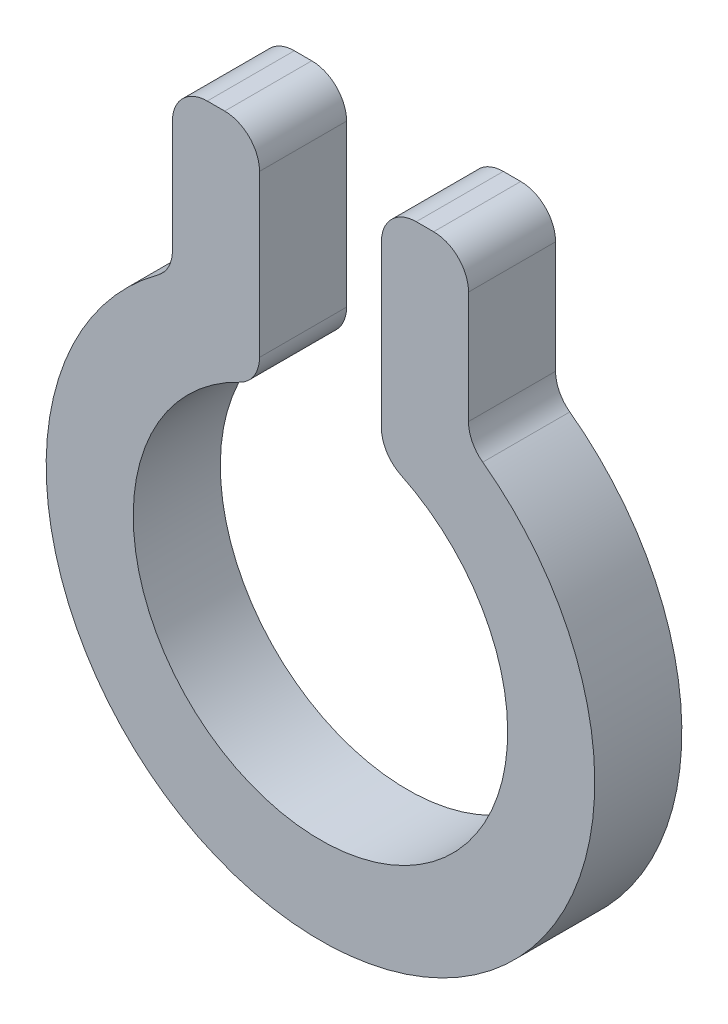
ISO-10303-21;
HEADER;
FILE_DESCRIPTION(('STEP AP214'),'2;1');
FILE_NAME('part.step','',(''),(''),'','','');
FILE_SCHEMA(('AUTOMOTIVE_DESIGN { 1 0 10303 214 1 1 1 1 }'));
ENDSEC;
DATA;
#1=APPLICATION_CONTEXT('core data for automotive mechanical design processes');
#2=APPLICATION_PROTOCOL_DEFINITION('international standard','automotive_design',2000,#1);
#3=PRODUCT_CONTEXT('',#1,'mechanical');
#4=PRODUCT('Part','Part','',(#3));
#5=PRODUCT_RELATED_PRODUCT_CATEGORY('part','',(#4));
#6=PRODUCT_DEFINITION_FORMATION('','',#4);
#7=PRODUCT_DEFINITION_CONTEXT('part definition',#1,'design');
#8=PRODUCT_DEFINITION('design','',#6,#7);
#9=PRODUCT_DEFINITION_SHAPE('','',#8);
#10=(LENGTH_UNIT() NAMED_UNIT(*) SI_UNIT(.MILLI.,.METRE.));
#11=(NAMED_UNIT(*) PLANE_ANGLE_UNIT() SI_UNIT($,.RADIAN.));
#12=(NAMED_UNIT(*) SI_UNIT($,.STERADIAN.) SOLID_ANGLE_UNIT());
#13=UNCERTAINTY_MEASURE_WITH_UNIT(LENGTH_MEASURE(1.E-05),#10,'distance_accuracy_value','');
#14=(GEOMETRIC_REPRESENTATION_CONTEXT(3) GLOBAL_UNCERTAINTY_ASSIGNED_CONTEXT((#13)) GLOBAL_UNIT_ASSIGNED_CONTEXT((#10,
#11,#12)) REPRESENTATION_CONTEXT('',''));
#15=CARTESIAN_POINT('',(0.,0.,0.));
#16=DIRECTION('',(0.,0.,1.));
#17=DIRECTION('',(1.,0.,0.));
#18=AXIS2_PLACEMENT_3D('',#15,#16,#17);
#19=CARTESIAN_POINT('',(0.,0.,5.));
#20=DIRECTION('',(0.,0.,-1.));
#21=DIRECTION('',(-1.,0.,0.));
#22=AXIS2_PLACEMENT_3D('',#19,#20,#21);
#23=CYLINDRICAL_SURFACE('',#22,15.75);
#24=CARTESIAN_POINT('',(0.,0.,0.));
#25=DIRECTION('',(0.,0.,1.));
#26=DIRECTION('',(1.,0.,0.));
#27=AXIS2_PLACEMENT_3D('',#24,#25,#26);
#28=CIRCLE('',#27,15.75);
#29=CARTESIAN_POINT('',(-9.3169014084507,12.6987341158562,0.));
#30=VERTEX_POINT('',#29);
#31=CARTESIAN_POINT('',(9.3169014084507,12.6987341158562,0.));
#32=VERTEX_POINT('',#31);
#33=EDGE_CURVE('E181',#30,#32,#28,.T.);
#34=ORIENTED_EDGE('',*,*,#33,.T.);
#35=DIRECTION('',(0.,0.,-1.));
#36=VECTOR('',#35,1.);
#37=CARTESIAN_POINT('',(9.3169014084507,12.6987341158562,5.));
#38=LINE('',#37,#36);
#39=CARTESIAN_POINT('',(9.3169014084507,12.6987341158562,5.));
#40=VERTEX_POINT('',#39);
#41=EDGE_CURVE('E158',#32,#40,#38,.F.);
#42=ORIENTED_EDGE('',*,*,#41,.T.);
#43=CARTESIAN_POINT('',(0.,0.,5.));
#44=DIRECTION('',(0.,0.,1.));
#45=DIRECTION('',(1.,0.,0.));
#46=AXIS2_PLACEMENT_3D('',#43,#44,#45);
#47=CIRCLE('',#46,15.75);
#48=CARTESIAN_POINT('',(-9.3169014084507,12.6987341158562,5.));
#49=VERTEX_POINT('',#48);
#50=EDGE_CURVE('E202',#49,#40,#47,.T.);
#51=ORIENTED_EDGE('',*,*,#50,.F.);
#52=DIRECTION('',(0.,0.,-1.));
#53=VECTOR('',#52,1.);
#54=CARTESIAN_POINT('',(-9.3169014084507,12.6987341158562,5.));
#55=LINE('',#54,#53);
#56=EDGE_CURVE('E174',#49,#30,#55,.T.);
#57=ORIENTED_EDGE('',*,*,#56,.T.);
#58=EDGE_LOOP('',(#34,#42,#51,#57));
#59=FACE_BOUND('',#58,.T.);
#60=ADVANCED_FACE('F38',(#59),#23,.T.);
#61=CARTESIAN_POINT('',(8.5,13.2594306061761,5.));
#62=DIRECTION('',(-1.,0.,0.));
#63=DIRECTION('',(0.,0.,1.));
#64=AXIS2_PLACEMENT_3D('',#61,#62,#63);
#65=PLANE('',#64);
#66=DIRECTION('',(0.,1.,0.));
#67=VECTOR('',#66,1.);
#68=CARTESIAN_POINT('',(8.5,13.2594306061761,5.));
#69=LINE('',#68,#67);
#70=CARTESIAN_POINT('',(8.5,14.3112717813617,5.));
#71=VERTEX_POINT('',#70);
#72=CARTESIAN_POINT('',(8.5,20.75,5.));
#73=VERTEX_POINT('',#72);
#74=EDGE_CURVE('E173',#71,#73,#69,.T.);
#75=ORIENTED_EDGE('',*,*,#74,.F.);
#76=DIRECTION('',(0.,0.,1.));
#77=VECTOR('',#76,1.);
#78=CARTESIAN_POINT('',(8.5,14.3112717813617,0.));
#79=LINE('',#78,#77);
#80=CARTESIAN_POINT('',(8.5,14.3112717813617,0.));
#81=VERTEX_POINT('',#80);
#82=EDGE_CURVE('E157',#71,#81,#79,.F.);
#83=ORIENTED_EDGE('',*,*,#82,.T.);
#84=DIRECTION('',(0.,1.,0.));
#85=VECTOR('',#84,1.);
#86=CARTESIAN_POINT('',(8.5,13.2594306061761,0.));
#87=LINE('',#86,#85);
#88=CARTESIAN_POINT('',(8.5,20.75,0.));
#89=VERTEX_POINT('',#88);
#90=EDGE_CURVE('E170',#81,#89,#87,.T.);
#91=ORIENTED_EDGE('',*,*,#90,.T.);
#92=DIRECTION('',(0.,0.,-1.));
#93=VECTOR('',#92,1.);
#94=CARTESIAN_POINT('',(8.5,20.75,5.));
#95=LINE('',#94,#93);
#96=EDGE_CURVE('E175',#89,#73,#95,.F.);
#97=ORIENTED_EDGE('',*,*,#96,.T.);
#98=EDGE_LOOP('',(#75,#83,#91,#97));
#99=FACE_BOUND('',#98,.T.);
#100=ADVANCED_FACE('F169',(#99),#65,.F.);
#101=CARTESIAN_POINT('',(3.5,22.75,5.));
#102=DIRECTION('',(0.,-1.,0.));
#103=DIRECTION('',(0.,0.,-1.));
#104=AXIS2_PLACEMENT_3D('',#101,#102,#103);
#105=PLANE('',#104);
#106=DIRECTION('',(-1.,0.,0.));
#107=VECTOR('',#106,1.);
#108=CARTESIAN_POINT('',(3.5,22.75,5.));
#109=LINE('',#108,#107);
#110=CARTESIAN_POINT('',(6.5,22.75,5.));
#111=VERTEX_POINT('',#110);
#112=CARTESIAN_POINT('',(5.5,22.75,5.));
#113=VERTEX_POINT('',#112);
#114=EDGE_CURVE('E275',#111,#113,#109,.T.);
#115=ORIENTED_EDGE('',*,*,#114,.F.);
#116=DIRECTION('',(0.,0.,-1.));
#117=VECTOR('',#116,1.);
#118=CARTESIAN_POINT('',(6.5,22.75,5.));
#119=LINE('',#118,#117);
#120=CARTESIAN_POINT('',(6.5,22.75,0.));
#121=VERTEX_POINT('',#120);
#122=EDGE_CURVE('E210',#111,#121,#119,.T.);
#123=ORIENTED_EDGE('',*,*,#122,.T.);
#124=DIRECTION('',(-1.,0.,0.));
#125=VECTOR('',#124,1.);
#126=CARTESIAN_POINT('',(3.5,22.75,0.));
#127=LINE('',#126,#125);
#128=CARTESIAN_POINT('',(5.5,22.75,0.));
#129=VERTEX_POINT('',#128);
#130=EDGE_CURVE('E180',#121,#129,#127,.T.);
#131=ORIENTED_EDGE('',*,*,#130,.T.);
#132=DIRECTION('',(0.,0.,-1.));
#133=VECTOR('',#132,1.);
#134=CARTESIAN_POINT('',(5.5,22.75,5.));
#135=LINE('',#134,#133);
#136=EDGE_CURVE('E208',#129,#113,#135,.F.);
#137=ORIENTED_EDGE('',*,*,#136,.T.);
#138=EDGE_LOOP('',(#115,#123,#131,#137));
#139=FACE_BOUND('',#138,.T.);
#140=ADVANCED_FACE('F325',(#139),#105,.F.);
#141=CARTESIAN_POINT('',(3.5,10.1642756751281,5.));
#142=DIRECTION('',(1.,0.,0.));
#143=DIRECTION('',(0.,1.,0.));
#144=AXIS2_PLACEMENT_3D('',#141,#142,#143);
#145=PLANE('',#144);
#146=DIRECTION('',(0.,-1.,0.));
#147=VECTOR('',#146,1.);
#148=CARTESIAN_POINT('',(3.5,10.1642756751281,5.));
#149=LINE('',#148,#147);
#150=CARTESIAN_POINT('',(3.5,20.75,5.));
#151=VERTEX_POINT('',#150);
#152=CARTESIAN_POINT('',(3.5,11.5027170703273,5.));
#153=VERTEX_POINT('',#152);
#154=EDGE_CURVE('E271',#151,#153,#149,.T.);
#155=ORIENTED_EDGE('',*,*,#154,.F.);
#156=DIRECTION('',(0.,0.,-1.));
#157=VECTOR('',#156,1.);
#158=CARTESIAN_POINT('',(3.5,20.75,5.));
#159=LINE('',#158,#157);
#160=CARTESIAN_POINT('',(3.5,20.75,0.));
#161=VERTEX_POINT('',#160);
#162=EDGE_CURVE('E312',#151,#161,#159,.T.);
#163=ORIENTED_EDGE('',*,*,#162,.T.);
#164=DIRECTION('',(0.,-1.,0.));
#165=VECTOR('',#164,1.);
#166=CARTESIAN_POINT('',(3.5,10.1642756751281,0.));
#167=LINE('',#166,#165);
#168=CARTESIAN_POINT('',(3.5,11.5027170703273,0.));
#169=VERTEX_POINT('',#168);
#170=EDGE_CURVE('E184',#161,#169,#167,.T.);
#171=ORIENTED_EDGE('',*,*,#170,.T.);
#172=DIRECTION('',(0.,0.,-1.));
#173=VECTOR('',#172,1.);
#174=CARTESIAN_POINT('',(3.5,11.5027170703273,5.));
#175=LINE('',#174,#173);
#176=EDGE_CURVE('E314',#169,#153,#175,.F.);
#177=ORIENTED_EDGE('',*,*,#176,.T.);
#178=EDGE_LOOP('',(#155,#163,#171,#177));
#179=FACE_BOUND('',#178,.T.);
#180=ADVANCED_FACE('F348',(#179),#145,.F.);
#181=CARTESIAN_POINT('',(0.,0.,5.));
#182=DIRECTION('',(0.,0.,-1.));
#183=DIRECTION('',(-1.,0.,0.));
#184=AXIS2_PLACEMENT_3D('',#181,#182,#183);
#185=CYLINDRICAL_SURFACE('',#184,10.75);
#186=CARTESIAN_POINT('',(0.,0.,5.));
#187=DIRECTION('',(0.,0.,-1.));
#188=DIRECTION('',(1.,0.,0.));
#189=AXIS2_PLACEMENT_3D('',#186,#187,#188);
#190=CIRCLE('',#189,10.75);
#191=CARTESIAN_POINT('',(4.63725490196078,9.69836929458972,5.));
#192=VERTEX_POINT('',#191);
#193=CARTESIAN_POINT('',(-4.63725490196078,9.69836929458972,5.));
#194=VERTEX_POINT('',#193);
#195=EDGE_CURVE('E246',#192,#194,#190,.T.);
#196=ORIENTED_EDGE('',*,*,#195,.F.);
#197=DIRECTION('',(0.,0.,-1.));
#198=VECTOR('',#197,1.);
#199=CARTESIAN_POINT('',(4.63725490196078,9.69836929458972,5.));
#200=LINE('',#199,#198);
#201=CARTESIAN_POINT('',(4.63725490196078,9.69836929458972,0.));
#202=VERTEX_POINT('',#201);
#203=EDGE_CURVE('E164',#192,#202,#200,.T.);
#204=ORIENTED_EDGE('',*,*,#203,.T.);
#205=CARTESIAN_POINT('',(0.,0.,0.));
#206=DIRECTION('',(0.,0.,-1.));
#207=DIRECTION('',(1.,0.,0.));
#208=AXIS2_PLACEMENT_3D('',#205,#206,#207);
#209=CIRCLE('',#208,10.75);
#210=CARTESIAN_POINT('',(-4.63725490196078,9.69836929458972,0.));
#211=VERTEX_POINT('',#210);
#212=EDGE_CURVE('E191',#202,#211,#209,.T.);
#213=ORIENTED_EDGE('',*,*,#212,.T.);
#214=DIRECTION('',(0.,0.,-1.));
#215=VECTOR('',#214,1.);
#216=CARTESIAN_POINT('',(-4.63725490196078,9.69836929458972,5.));
#217=LINE('',#216,#215);
#218=EDGE_CURVE('E296',#211,#194,#217,.F.);
#219=ORIENTED_EDGE('',*,*,#218,.T.);
#220=EDGE_LOOP('',(#196,#204,#213,#219));
#221=FACE_BOUND('',#220,.T.);
#222=ADVANCED_FACE('F351',(#221),#185,.F.);
#223=CARTESIAN_POINT('',(-3.5,10.1642756751281,5.));
#224=DIRECTION('',(-1.,0.,0.));
#225=DIRECTION('',(0.,-1.,0.));
#226=AXIS2_PLACEMENT_3D('',#223,#224,#225);
#227=PLANE('',#226);
#228=DIRECTION('',(0.,1.,0.));
#229=VECTOR('',#228,1.);
#230=CARTESIAN_POINT('',(-3.5,10.1642756751281,0.));
#231=LINE('',#230,#229);
#232=CARTESIAN_POINT('',(-3.5,11.5027170703273,0.));
#233=VERTEX_POINT('',#232);
#234=CARTESIAN_POINT('',(-3.5,20.75,0.));
#235=VERTEX_POINT('',#234);
#236=EDGE_CURVE('E194',#233,#235,#231,.T.);
#237=ORIENTED_EDGE('',*,*,#236,.T.);
#238=DIRECTION('',(0.,0.,-1.));
#239=VECTOR('',#238,1.);
#240=CARTESIAN_POINT('',(-3.5,20.75,5.));
#241=LINE('',#240,#239);
#242=CARTESIAN_POINT('',(-3.5,20.75,5.));
#243=VERTEX_POINT('',#242);
#244=EDGE_CURVE('E302',#235,#243,#241,.F.);
#245=ORIENTED_EDGE('',*,*,#244,.T.);
#246=DIRECTION('',(0.,1.,0.));
#247=VECTOR('',#246,1.);
#248=CARTESIAN_POINT('',(-3.5,10.1642756751281,5.));
#249=LINE('',#248,#247);
#250=CARTESIAN_POINT('',(-3.5,11.5027170703273,5.));
#251=VERTEX_POINT('',#250);
#252=EDGE_CURVE('E240',#251,#243,#249,.T.);
#253=ORIENTED_EDGE('',*,*,#252,.F.);
#254=DIRECTION('',(0.,0.,-1.));
#255=VECTOR('',#254,1.);
#256=CARTESIAN_POINT('',(-3.5,11.5027170703273,5.));
#257=LINE('',#256,#255);
#258=EDGE_CURVE('E304',#251,#233,#257,.T.);
#259=ORIENTED_EDGE('',*,*,#258,.T.);
#260=EDGE_LOOP('',(#237,#245,#253,#259));
#261=FACE_BOUND('',#260,.T.);
#262=ADVANCED_FACE('F354',(#261),#227,.F.);
#263=CARTESIAN_POINT('',(-8.5,22.75,5.));
#264=DIRECTION('',(0.,-1.,0.));
#265=DIRECTION('',(0.,0.,-1.));
#266=AXIS2_PLACEMENT_3D('',#263,#264,#265);
#267=PLANE('',#266);
#268=DIRECTION('',(-1.,0.,0.));
#269=VECTOR('',#268,1.);
#270=CARTESIAN_POINT('',(-8.5,22.75,5.));
#271=LINE('',#270,#269);
#272=CARTESIAN_POINT('',(-5.5,22.75,5.));
#273=VERTEX_POINT('',#272);
#274=CARTESIAN_POINT('',(-6.5,22.75,5.));
#275=VERTEX_POINT('',#274);
#276=EDGE_CURVE('E245',#273,#275,#271,.T.);
#277=ORIENTED_EDGE('',*,*,#276,.F.);
#278=DIRECTION('',(0.,0.,-1.));
#279=VECTOR('',#278,1.);
#280=CARTESIAN_POINT('',(-5.5,22.75,5.));
#281=LINE('',#280,#279);
#282=CARTESIAN_POINT('',(-5.5,22.75,0.));
#283=VERTEX_POINT('',#282);
#284=EDGE_CURVE('E307',#273,#283,#281,.T.);
#285=ORIENTED_EDGE('',*,*,#284,.T.);
#286=DIRECTION('',(-1.,0.,0.));
#287=VECTOR('',#286,1.);
#288=CARTESIAN_POINT('',(-8.5,22.75,0.));
#289=LINE('',#288,#287);
#290=CARTESIAN_POINT('',(-6.5,22.75,0.));
#291=VERTEX_POINT('',#290);
#292=EDGE_CURVE('E197',#283,#291,#289,.T.);
#293=ORIENTED_EDGE('',*,*,#292,.T.);
#294=DIRECTION('',(0.,0.,-1.));
#295=VECTOR('',#294,1.);
#296=CARTESIAN_POINT('',(-6.5,22.75,5.));
#297=LINE('',#296,#295);
#298=EDGE_CURVE('E310',#291,#275,#297,.F.);
#299=ORIENTED_EDGE('',*,*,#298,.T.);
#300=EDGE_LOOP('',(#277,#285,#293,#299));
#301=FACE_BOUND('',#300,.T.);
#302=ADVANCED_FACE('F358',(#301),#267,.F.);
#303=CARTESIAN_POINT('',(-8.5,13.2594306061761,5.));
#304=DIRECTION('',(1.,0.,0.));
#305=DIRECTION('',(0.,0.,-1.));
#306=AXIS2_PLACEMENT_3D('',#303,#304,#305);
#307=PLANE('',#306);
#308=DIRECTION('',(0.,-1.,0.));
#309=VECTOR('',#308,1.);
#310=CARTESIAN_POINT('',(-8.5,13.2594306061761,5.));
#311=LINE('',#310,#309);
#312=CARTESIAN_POINT('',(-8.5,20.75,5.));
#313=VERTEX_POINT('',#312);
#314=CARTESIAN_POINT('',(-8.5,14.3112717813617,5.));
#315=VERTEX_POINT('',#314);
#316=EDGE_CURVE('E203',#313,#315,#311,.T.);
#317=ORIENTED_EDGE('',*,*,#316,.F.);
#318=DIRECTION('',(0.,0.,-1.));
#319=VECTOR('',#318,1.);
#320=CARTESIAN_POINT('',(-8.5,20.75,5.));
#321=LINE('',#320,#319);
#322=CARTESIAN_POINT('',(-8.5,20.75,0.));
#323=VERTEX_POINT('',#322);
#324=EDGE_CURVE('E298',#313,#323,#321,.T.);
#325=ORIENTED_EDGE('',*,*,#324,.T.);
#326=DIRECTION('',(0.,-1.,0.));
#327=VECTOR('',#326,1.);
#328=CARTESIAN_POINT('',(-8.5,13.2594306061761,0.));
#329=LINE('',#328,#327);
#330=CARTESIAN_POINT('',(-8.5,14.3112717813617,0.));
#331=VERTEX_POINT('',#330);
#332=EDGE_CURVE('E200',#323,#331,#329,.T.);
#333=ORIENTED_EDGE('',*,*,#332,.T.);
#334=DIRECTION('',(0.,0.,1.));
#335=VECTOR('',#334,1.);
#336=CARTESIAN_POINT('',(-8.5,14.3112717813617,5.));
#337=LINE('',#336,#335);
#338=EDGE_CURVE('E54',#331,#315,#337,.T.);
#339=ORIENTED_EDGE('',*,*,#338,.T.);
#340=EDGE_LOOP('',(#317,#325,#333,#339));
#341=FACE_BOUND('',#340,.T.);
#342=ADVANCED_FACE('F362',(#341),#307,.F.);
#343=CARTESIAN_POINT('',(0.,0.,5.));
#344=DIRECTION('',(0.,0.,1.));
#345=DIRECTION('',(1.,0.,0.));
#346=AXIS2_PLACEMENT_3D('',#343,#344,#345);
#347=PLANE('',#346);
#348=ORIENTED_EDGE('',*,*,#74,.T.);
#349=CARTESIAN_POINT('',(6.5,20.75,5.));
#350=DIRECTION('',(0.,0.,1.));
#351=DIRECTION('',(1.,0.,0.));
#352=AXIS2_PLACEMENT_3D('',#349,#350,#351);
#353=CIRCLE('',#352,2.);
#354=EDGE_CURVE('E263',#73,#111,#353,.T.);
#355=ORIENTED_EDGE('',*,*,#354,.T.);
#356=ORIENTED_EDGE('',*,*,#114,.T.);
#357=CARTESIAN_POINT('',(5.5,20.75,5.));
#358=DIRECTION('',(0.,0.,1.));
#359=DIRECTION('',(1.,0.,0.));
#360=AXIS2_PLACEMENT_3D('',#357,#358,#359);
#361=CIRCLE('',#360,2.);
#362=EDGE_CURVE('E259',#113,#151,#361,.T.);
#363=ORIENTED_EDGE('',*,*,#362,.T.);
#364=ORIENTED_EDGE('',*,*,#154,.T.);
#365=CARTESIAN_POINT('',(5.5,11.5027170703273,5.));
#366=DIRECTION('',(0.,0.,1.));
#367=DIRECTION('',(1.,0.,0.));
#368=AXIS2_PLACEMENT_3D('',#365,#366,#367);
#369=CIRCLE('',#368,2.);
#370=EDGE_CURVE('E228',#153,#192,#369,.T.);
#371=ORIENTED_EDGE('',*,*,#370,.T.);
#372=ORIENTED_EDGE('',*,*,#195,.T.);
#373=CARTESIAN_POINT('',(-5.5,11.5027170703273,5.));
#374=DIRECTION('',(0.,0.,1.));
#375=DIRECTION('',(1.,0.,0.));
#376=AXIS2_PLACEMENT_3D('',#373,#374,#375);
#377=CIRCLE('',#376,2.);
#378=EDGE_CURVE('E224',#194,#251,#377,.T.);
#379=ORIENTED_EDGE('',*,*,#378,.T.);
#380=ORIENTED_EDGE('',*,*,#252,.T.);
#381=CARTESIAN_POINT('',(-5.5,20.75,5.));
#382=DIRECTION('',(0.,0.,1.));
#383=DIRECTION('',(1.,0.,0.));
#384=AXIS2_PLACEMENT_3D('',#381,#382,#383);
#385=CIRCLE('',#384,2.);
#386=EDGE_CURVE('E255',#243,#273,#385,.T.);
#387=ORIENTED_EDGE('',*,*,#386,.T.);
#388=ORIENTED_EDGE('',*,*,#276,.T.);
#389=CARTESIAN_POINT('',(-6.5,20.75,5.));
#390=DIRECTION('',(0.,0.,1.));
#391=DIRECTION('',(1.,0.,0.));
#392=AXIS2_PLACEMENT_3D('',#389,#390,#391);
#393=CIRCLE('',#392,2.);
#394=EDGE_CURVE('E61',#275,#313,#393,.T.);
#395=ORIENTED_EDGE('',*,*,#394,.T.);
#396=ORIENTED_EDGE('',*,*,#316,.T.);
#397=CARTESIAN_POINT('',(-10.5,14.3112717813617,5.));
#398=DIRECTION('',(0.,0.,1.));
#399=DIRECTION('',(1.,0.,0.));
#400=AXIS2_PLACEMENT_3D('',#397,#398,#399);
#401=CIRCLE('',#400,2.);
#402=EDGE_CURVE('E12',#315,#49,#401,.F.);
#403=ORIENTED_EDGE('',*,*,#402,.T.);
#404=ORIENTED_EDGE('',*,*,#50,.T.);
#405=CARTESIAN_POINT('',(10.5,14.3112717813617,5.));
#406=DIRECTION('',(0.,0.,1.));
#407=DIRECTION('',(1.,0.,0.));
#408=AXIS2_PLACEMENT_3D('',#405,#406,#407);
#409=CIRCLE('',#408,2.);
#410=EDGE_CURVE('E163',#40,#71,#409,.F.);
#411=ORIENTED_EDGE('',*,*,#410,.T.);
#412=EDGE_LOOP('',(#348,#355,#356,#363,#364,#371,#372,#379,#380,#387,#388,#395,#396,#403,#404,#411));
#413=FACE_BOUND('',#412,.T.);
#414=ADVANCED_FACE('F288',(#413),#347,.T.);
#415=CARTESIAN_POINT('',(0.,0.,0.));
#416=DIRECTION('',(0.,0.,1.));
#417=DIRECTION('',(1.,0.,0.));
#418=AXIS2_PLACEMENT_3D('',#415,#416,#417);
#419=PLANE('',#418);
#420=ORIENTED_EDGE('',*,*,#130,.F.);
#421=CARTESIAN_POINT('',(6.5,20.75,0.));
#422=DIRECTION('',(0.,0.,1.));
#423=DIRECTION('',(1.,0.,0.));
#424=AXIS2_PLACEMENT_3D('',#421,#422,#423);
#425=CIRCLE('',#424,2.);
#426=EDGE_CURVE('E179',#121,#89,#425,.F.);
#427=ORIENTED_EDGE('',*,*,#426,.T.);
#428=ORIENTED_EDGE('',*,*,#90,.F.);
#429=CARTESIAN_POINT('',(10.5,14.3112717813617,0.));
#430=DIRECTION('',(0.,0.,1.));
#431=DIRECTION('',(1.,0.,0.));
#432=AXIS2_PLACEMENT_3D('',#429,#430,#431);
#433=CIRCLE('',#432,2.);
#434=EDGE_CURVE('E153',#81,#32,#433,.T.);
#435=ORIENTED_EDGE('',*,*,#434,.T.);
#436=ORIENTED_EDGE('',*,*,#33,.F.);
#437=CARTESIAN_POINT('',(-10.5,14.3112717813617,0.));
#438=DIRECTION('',(0.,0.,1.));
#439=DIRECTION('',(1.,0.,0.));
#440=AXIS2_PLACEMENT_3D('',#437,#438,#439);
#441=CIRCLE('',#440,2.);
#442=EDGE_CURVE('E47',#30,#331,#441,.T.);
#443=ORIENTED_EDGE('',*,*,#442,.T.);
#444=ORIENTED_EDGE('',*,*,#332,.F.);
#445=CARTESIAN_POINT('',(-6.5,20.75,0.));
#446=DIRECTION('',(0.,0.,1.));
#447=DIRECTION('',(1.,0.,0.));
#448=AXIS2_PLACEMENT_3D('',#445,#446,#447);
#449=CIRCLE('',#448,2.);
#450=EDGE_CURVE('E217',#323,#291,#449,.F.);
#451=ORIENTED_EDGE('',*,*,#450,.T.);
#452=ORIENTED_EDGE('',*,*,#292,.F.);
#453=CARTESIAN_POINT('',(-5.5,20.75,0.));
#454=DIRECTION('',(0.,0.,1.));
#455=DIRECTION('',(1.,0.,0.));
#456=AXIS2_PLACEMENT_3D('',#453,#454,#455);
#457=CIRCLE('',#456,2.);
#458=EDGE_CURVE('E219',#283,#235,#457,.F.);
#459=ORIENTED_EDGE('',*,*,#458,.T.);
#460=ORIENTED_EDGE('',*,*,#236,.F.);
#461=CARTESIAN_POINT('',(-5.5,11.5027170703273,0.));
#462=DIRECTION('',(0.,0.,1.));
#463=DIRECTION('',(1.,0.,0.));
#464=AXIS2_PLACEMENT_3D('',#461,#462,#463);
#465=CIRCLE('',#464,2.);
#466=EDGE_CURVE('E213',#233,#211,#465,.F.);
#467=ORIENTED_EDGE('',*,*,#466,.T.);
#468=ORIENTED_EDGE('',*,*,#212,.F.);
#469=CARTESIAN_POINT('',(5.5,11.5027170703273,0.));
#470=DIRECTION('',(0.,0.,1.));
#471=DIRECTION('',(1.,0.,0.));
#472=AXIS2_PLACEMENT_3D('',#469,#470,#471);
#473=CIRCLE('',#472,2.);
#474=EDGE_CURVE('E215',#202,#169,#473,.F.);
#475=ORIENTED_EDGE('',*,*,#474,.T.);
#476=ORIENTED_EDGE('',*,*,#170,.F.);
#477=CARTESIAN_POINT('',(5.5,20.75,0.));
#478=DIRECTION('',(0.,0.,1.));
#479=DIRECTION('',(1.,0.,0.));
#480=AXIS2_PLACEMENT_3D('',#477,#478,#479);
#481=CIRCLE('',#480,2.);
#482=EDGE_CURVE('E221',#161,#129,#481,.F.);
#483=ORIENTED_EDGE('',*,*,#482,.T.);
#484=EDGE_LOOP('',(#420,#427,#428,#435,#436,#443,#444,#451,#452,#459,#460,#467,#468,#475,#476,#483));
#485=FACE_BOUND('',#484,.T.);
#486=ADVANCED_FACE('F178',(#485),#419,.F.);
#487=CARTESIAN_POINT('',(10.5,14.3112717813617,5.));
#488=DIRECTION('',(0.,0.,-1.));
#489=DIRECTION('',(-1.,0.,0.));
#490=AXIS2_PLACEMENT_3D('',#487,#488,#489);
#491=CYLINDRICAL_SURFACE('',#490,2.);
#492=ORIENTED_EDGE('',*,*,#410,.F.);
#493=ORIENTED_EDGE('',*,*,#41,.F.);
#494=ORIENTED_EDGE('',*,*,#434,.F.);
#495=ORIENTED_EDGE('',*,*,#82,.F.);
#496=EDGE_LOOP('',(#492,#493,#494,#495));
#497=FACE_BOUND('',#496,.T.);
#498=ADVANCED_FACE('F156',(#497),#491,.F.);
#499=CARTESIAN_POINT('',(6.5,20.75,5.));
#500=DIRECTION('',(0.,0.,-1.));
#501=DIRECTION('',(-1.,0.,0.));
#502=AXIS2_PLACEMENT_3D('',#499,#500,#501);
#503=CYLINDRICAL_SURFACE('',#502,2.);
#504=ORIENTED_EDGE('',*,*,#354,.F.);
#505=ORIENTED_EDGE('',*,*,#96,.F.);
#506=ORIENTED_EDGE('',*,*,#426,.F.);
#507=ORIENTED_EDGE('',*,*,#122,.F.);
#508=EDGE_LOOP('',(#504,#505,#506,#507));
#509=FACE_BOUND('',#508,.T.);
#510=ADVANCED_FACE('F327',(#509),#503,.T.);
#511=CARTESIAN_POINT('',(5.5,20.75,5.));
#512=DIRECTION('',(0.,0.,-1.));
#513=DIRECTION('',(-1.,0.,0.));
#514=AXIS2_PLACEMENT_3D('',#511,#512,#513);
#515=CYLINDRICAL_SURFACE('',#514,2.);
#516=ORIENTED_EDGE('',*,*,#362,.F.);
#517=ORIENTED_EDGE('',*,*,#136,.F.);
#518=ORIENTED_EDGE('',*,*,#482,.F.);
#519=ORIENTED_EDGE('',*,*,#162,.F.);
#520=EDGE_LOOP('',(#516,#517,#518,#519));
#521=FACE_BOUND('',#520,.T.);
#522=ADVANCED_FACE('F329',(#521),#515,.T.);
#523=CARTESIAN_POINT('',(-5.5,20.75,5.));
#524=DIRECTION('',(0.,0.,-1.));
#525=DIRECTION('',(-1.,0.,0.));
#526=AXIS2_PLACEMENT_3D('',#523,#524,#525);
#527=CYLINDRICAL_SURFACE('',#526,2.);
#528=ORIENTED_EDGE('',*,*,#386,.F.);
#529=ORIENTED_EDGE('',*,*,#244,.F.);
#530=ORIENTED_EDGE('',*,*,#458,.F.);
#531=ORIENTED_EDGE('',*,*,#284,.F.);
#532=EDGE_LOOP('',(#528,#529,#530,#531));
#533=FACE_BOUND('',#532,.T.);
#534=ADVANCED_FACE('F335',(#533),#527,.T.);
#535=CARTESIAN_POINT('',(-6.5,20.75,5.));
#536=DIRECTION('',(0.,0.,-1.));
#537=DIRECTION('',(-1.,0.,0.));
#538=AXIS2_PLACEMENT_3D('',#535,#536,#537);
#539=CYLINDRICAL_SURFACE('',#538,2.);
#540=ORIENTED_EDGE('',*,*,#394,.F.);
#541=ORIENTED_EDGE('',*,*,#298,.F.);
#542=ORIENTED_EDGE('',*,*,#450,.F.);
#543=ORIENTED_EDGE('',*,*,#324,.F.);
#544=EDGE_LOOP('',(#540,#541,#542,#543));
#545=FACE_BOUND('',#544,.T.);
#546=ADVANCED_FACE('F400',(#545),#539,.T.);
#547=CARTESIAN_POINT('',(-10.5,14.3112717813617,5.));
#548=DIRECTION('',(0.,0.,-1.));
#549=DIRECTION('',(-1.,0.,0.));
#550=AXIS2_PLACEMENT_3D('',#547,#548,#549);
#551=CYLINDRICAL_SURFACE('',#550,2.);
#552=ORIENTED_EDGE('',*,*,#402,.F.);
#553=ORIENTED_EDGE('',*,*,#338,.F.);
#554=ORIENTED_EDGE('',*,*,#442,.F.);
#555=ORIENTED_EDGE('',*,*,#56,.F.);
#556=EDGE_LOOP('',(#552,#553,#554,#555));
#557=FACE_BOUND('',#556,.T.);
#558=ADVANCED_FACE('F410',(#557),#551,.F.);
#559=CARTESIAN_POINT('',(5.5,11.5027170703273,5.));
#560=DIRECTION('',(0.,0.,-1.));
#561=DIRECTION('',(-1.,0.,0.));
#562=AXIS2_PLACEMENT_3D('',#559,#560,#561);
#563=CYLINDRICAL_SURFACE('',#562,2.);
#564=ORIENTED_EDGE('',*,*,#370,.F.);
#565=ORIENTED_EDGE('',*,*,#176,.F.);
#566=ORIENTED_EDGE('',*,*,#474,.F.);
#567=ORIENTED_EDGE('',*,*,#203,.F.);
#568=EDGE_LOOP('',(#564,#565,#566,#567));
#569=FACE_BOUND('',#568,.T.);
#570=ADVANCED_FACE('F420',(#569),#563,.T.);
#571=CARTESIAN_POINT('',(-5.5,11.5027170703273,5.));
#572=DIRECTION('',(0.,0.,-1.));
#573=DIRECTION('',(-1.,0.,0.));
#574=AXIS2_PLACEMENT_3D('',#571,#572,#573);
#575=CYLINDRICAL_SURFACE('',#574,2.);
#576=ORIENTED_EDGE('',*,*,#378,.F.);
#577=ORIENTED_EDGE('',*,*,#218,.F.);
#578=ORIENTED_EDGE('',*,*,#466,.F.);
#579=ORIENTED_EDGE('',*,*,#258,.F.);
#580=EDGE_LOOP('',(#576,#577,#578,#579));
#581=FACE_BOUND('',#580,.T.);
#582=ADVANCED_FACE('F40',(#581),#575,.T.);
#583=CLOSED_SHELL('',(#60,#100,#140,#180,#222,#262,#302,#342,#414,#486,#498,#510,#522,#534,#546,
#558,#570,#582));
#584=MANIFOLD_SOLID_BREP('B2',#583);
#585=ADVANCED_BREP_SHAPE_REPRESENTATION('',(#18,#584),#14);
#586=SHAPE_DEFINITION_REPRESENTATION(#9,#585);
ENDSEC;
END-ISO-10303-21;
